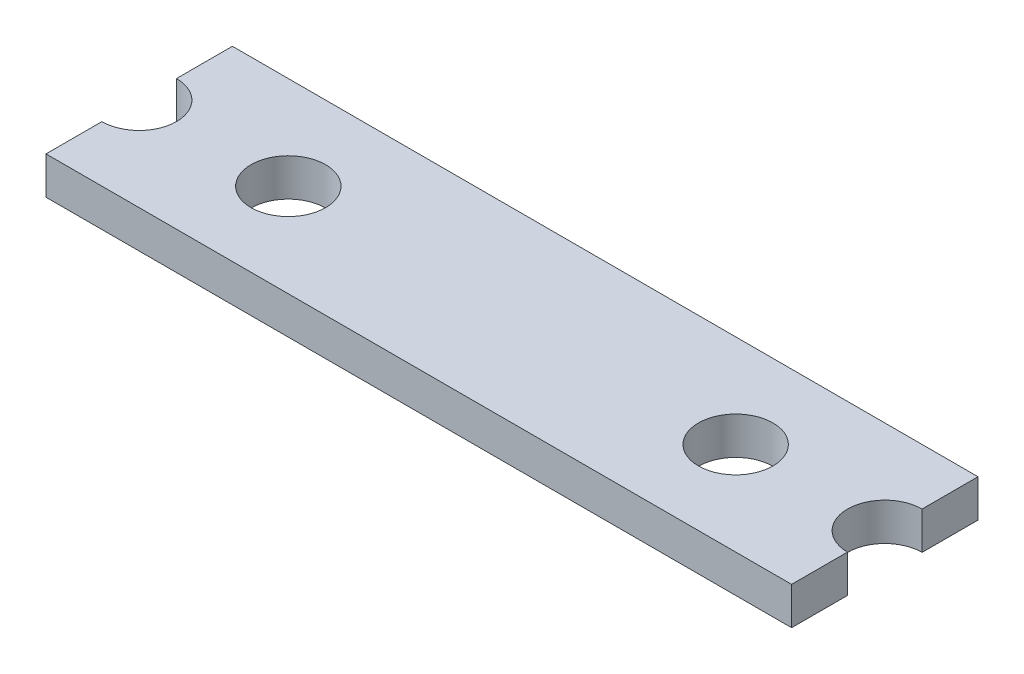
ISO-10303-21;
HEADER;
FILE_DESCRIPTION(('STEP AP214'),'2;1');
FILE_NAME('part.step','',(''),(''),'','','');
FILE_SCHEMA(('AUTOMOTIVE_DESIGN { 1 0 10303 214 1 1 1 1 }'));
ENDSEC;
DATA;
#1=APPLICATION_CONTEXT('core data for automotive mechanical design processes');
#2=APPLICATION_PROTOCOL_DEFINITION('international standard','automotive_design',2000,#1);
#3=PRODUCT_CONTEXT('',#1,'mechanical');
#4=PRODUCT('Part','Part','',(#3));
#5=PRODUCT_RELATED_PRODUCT_CATEGORY('part','',(#4));
#6=PRODUCT_DEFINITION_FORMATION('','',#4);
#7=PRODUCT_DEFINITION_CONTEXT('part definition',#1,'design');
#8=PRODUCT_DEFINITION('design','',#6,#7);
#9=PRODUCT_DEFINITION_SHAPE('','',#8);
#10=(LENGTH_UNIT() NAMED_UNIT(*) SI_UNIT(.MILLI.,.METRE.));
#11=(NAMED_UNIT(*) PLANE_ANGLE_UNIT() SI_UNIT($,.RADIAN.));
#12=(NAMED_UNIT(*) SI_UNIT($,.STERADIAN.) SOLID_ANGLE_UNIT());
#13=UNCERTAINTY_MEASURE_WITH_UNIT(LENGTH_MEASURE(1.E-05),#10,'distance_accuracy_value','');
#14=(GEOMETRIC_REPRESENTATION_CONTEXT(3) GLOBAL_UNCERTAINTY_ASSIGNED_CONTEXT((#13)) GLOBAL_UNIT_ASSIGNED_CONTEXT((#10,
#11,#12)) REPRESENTATION_CONTEXT('',''));
#15=CARTESIAN_POINT('',(0.,0.,0.));
#16=DIRECTION('',(0.,0.,1.));
#17=DIRECTION('',(1.,0.,0.));
#18=AXIS2_PLACEMENT_3D('',#15,#16,#17);
#19=CARTESIAN_POINT('',(-15.875,1.6,3.96875));
#20=DIRECTION('',(1.,0.,0.));
#21=DIRECTION('',(0.,0.,-1.));
#22=AXIS2_PLACEMENT_3D('',#19,#20,#21);
#23=PLANE('',#22);
#24=DIRECTION('',(0.,0.,1.));
#25=VECTOR('',#24,1.);
#26=CARTESIAN_POINT('',(-15.875,0.,3.96875));
#27=LINE('',#26,#25);
#28=CARTESIAN_POINT('',(-15.875,0.,-3.96875));
#29=VERTEX_POINT('',#28);
#30=CARTESIAN_POINT('',(-15.875,0.,-1.5875));
#31=VERTEX_POINT('',#30);
#32=EDGE_CURVE('E117',#29,#31,#27,.T.);
#33=ORIENTED_EDGE('',*,*,#32,.T.);
#34=DIRECTION('',(0.,1.,0.));
#35=VECTOR('',#34,1.);
#36=CARTESIAN_POINT('',(-15.875,0.,-1.5875));
#37=LINE('',#36,#35);
#38=CARTESIAN_POINT('',(-15.875,1.6,-1.5875));
#39=VERTEX_POINT('',#38);
#40=EDGE_CURVE('E55',#31,#39,#37,.T.);
#41=ORIENTED_EDGE('',*,*,#40,.T.);
#42=DIRECTION('',(0.,0.,1.));
#43=VECTOR('',#42,1.);
#44=CARTESIAN_POINT('',(-15.875,1.6,3.96875));
#45=LINE('',#44,#43);
#46=CARTESIAN_POINT('',(-15.875,1.6,-3.96875));
#47=VERTEX_POINT('',#46);
#48=EDGE_CURVE('E162',#47,#39,#45,.T.);
#49=ORIENTED_EDGE('',*,*,#48,.F.);
#50=DIRECTION('',(0.,-1.,0.));
#51=VECTOR('',#50,1.);
#52=CARTESIAN_POINT('',(-15.875,1.6,-3.96875));
#53=LINE('',#52,#51);
#54=EDGE_CURVE('E134',#47,#29,#53,.T.);
#55=ORIENTED_EDGE('',*,*,#54,.T.);
#56=EDGE_LOOP('',(#33,#41,#49,#55));
#57=FACE_BOUND('',#56,.T.);
#58=ADVANCED_FACE('F32',(#57),#23,.F.);
#59=CARTESIAN_POINT('',(15.875,1.6,3.96875));
#60=DIRECTION('',(-1.,0.,0.));
#61=DIRECTION('',(0.,0.,1.));
#62=AXIS2_PLACEMENT_3D('',#59,#60,#61);
#63=PLANE('',#62);
#64=DIRECTION('',(0.,0.,-1.));
#65=VECTOR('',#64,1.);
#66=CARTESIAN_POINT('',(15.875,0.,3.96875));
#67=LINE('',#66,#65);
#68=CARTESIAN_POINT('',(15.875,0.,3.96875));
#69=VERTEX_POINT('',#68);
#70=CARTESIAN_POINT('',(15.875,0.,1.5875));
#71=VERTEX_POINT('',#70);
#72=EDGE_CURVE('E129',#69,#71,#67,.T.);
#73=ORIENTED_EDGE('',*,*,#72,.T.);
#74=DIRECTION('',(0.,1.,0.));
#75=VECTOR('',#74,1.);
#76=CARTESIAN_POINT('',(15.875,0.,1.5875));
#77=LINE('',#76,#75);
#78=CARTESIAN_POINT('',(15.875,1.6,1.5875));
#79=VERTEX_POINT('',#78);
#80=EDGE_CURVE('E47',#71,#79,#77,.T.);
#81=ORIENTED_EDGE('',*,*,#80,.T.);
#82=DIRECTION('',(0.,0.,-1.));
#83=VECTOR('',#82,1.);
#84=CARTESIAN_POINT('',(15.875,1.6,3.96875));
#85=LINE('',#84,#83);
#86=CARTESIAN_POINT('',(15.875,1.6,3.96875));
#87=VERTEX_POINT('',#86);
#88=EDGE_CURVE('E145',#87,#79,#85,.T.);
#89=ORIENTED_EDGE('',*,*,#88,.F.);
#90=DIRECTION('',(0.,-1.,0.));
#91=VECTOR('',#90,1.);
#92=CARTESIAN_POINT('',(15.875,1.6,3.96875));
#93=LINE('',#92,#91);
#94=EDGE_CURVE('E40',#87,#69,#93,.T.);
#95=ORIENTED_EDGE('',*,*,#94,.T.);
#96=EDGE_LOOP('',(#73,#81,#89,#95));
#97=FACE_BOUND('',#96,.T.);
#98=ADVANCED_FACE('F143',(#97),#63,.F.);
#99=CARTESIAN_POINT('',(-15.875,1.6,1.5875));
#100=VERTEX_POINT('',#99);
#101=CARTESIAN_POINT('',(-15.875,1.6,3.96875));
#102=VERTEX_POINT('',#101);
#103=EDGE_CURVE('E110',#100,#102,#45,.T.);
#104=ORIENTED_EDGE('',*,*,#103,.F.);
#105=DIRECTION('',(0.,1.,0.));
#106=VECTOR('',#105,1.);
#107=CARTESIAN_POINT('',(-15.875,0.,1.5875));
#108=LINE('',#107,#106);
#109=CARTESIAN_POINT('',(-15.875,0.,1.5875));
#110=VERTEX_POINT('',#109);
#111=EDGE_CURVE('E97',#110,#100,#108,.T.);
#112=ORIENTED_EDGE('',*,*,#111,.F.);
#113=CARTESIAN_POINT('',(-15.875,0.,3.96875));
#114=VERTEX_POINT('',#113);
#115=EDGE_CURVE('E108',#110,#114,#27,.T.);
#116=ORIENTED_EDGE('',*,*,#115,.T.);
#117=DIRECTION('',(0.,-1.,0.));
#118=VECTOR('',#117,1.);
#119=CARTESIAN_POINT('',(-15.875,1.6,3.96875));
#120=LINE('',#119,#118);
#121=EDGE_CURVE('E11',#102,#114,#120,.T.);
#122=ORIENTED_EDGE('',*,*,#121,.F.);
#123=EDGE_LOOP('',(#104,#112,#116,#122));
#124=FACE_BOUND('',#123,.T.);
#125=ADVANCED_FACE('F34',(#124),#23,.F.);
#126=CARTESIAN_POINT('',(15.875,1.6,3.96875));
#127=DIRECTION('',(0.,0.,-1.));
#128=DIRECTION('',(-1.,0.,0.));
#129=AXIS2_PLACEMENT_3D('',#126,#127,#128);
#130=PLANE('',#129);
#131=DIRECTION('',(1.,0.,0.));
#132=VECTOR('',#131,1.);
#133=CARTESIAN_POINT('',(15.875,0.,3.96875));
#134=LINE('',#133,#132);
#135=EDGE_CURVE('E116',#114,#69,#134,.T.);
#136=ORIENTED_EDGE('',*,*,#135,.T.);
#137=ORIENTED_EDGE('',*,*,#94,.F.);
#138=DIRECTION('',(1.,0.,0.));
#139=VECTOR('',#138,1.);
#140=CARTESIAN_POINT('',(15.875,1.6,3.96875));
#141=LINE('',#140,#139);
#142=EDGE_CURVE('E165',#102,#87,#141,.T.);
#143=ORIENTED_EDGE('',*,*,#142,.F.);
#144=ORIENTED_EDGE('',*,*,#121,.T.);
#145=EDGE_LOOP('',(#136,#137,#143,#144));
#146=FACE_BOUND('',#145,.T.);
#147=ADVANCED_FACE('F216',(#146),#130,.F.);
#148=CARTESIAN_POINT('',(15.875,1.6,-1.5875));
#149=VERTEX_POINT('',#148);
#150=CARTESIAN_POINT('',(15.875,1.6,-3.96875));
#151=VERTEX_POINT('',#150);
#152=EDGE_CURVE('E166',#149,#151,#85,.T.);
#153=ORIENTED_EDGE('',*,*,#152,.F.);
#154=DIRECTION('',(0.,1.,0.));
#155=VECTOR('',#154,1.);
#156=CARTESIAN_POINT('',(15.875,0.,-1.5875));
#157=LINE('',#156,#155);
#158=CARTESIAN_POINT('',(15.875,0.,-1.5875));
#159=VERTEX_POINT('',#158);
#160=EDGE_CURVE('E153',#159,#149,#157,.T.);
#161=ORIENTED_EDGE('',*,*,#160,.F.);
#162=CARTESIAN_POINT('',(15.875,0.,-3.96875));
#163=VERTEX_POINT('',#162);
#164=EDGE_CURVE('E128',#159,#163,#67,.T.);
#165=ORIENTED_EDGE('',*,*,#164,.T.);
#166=DIRECTION('',(0.,-1.,0.));
#167=VECTOR('',#166,1.);
#168=CARTESIAN_POINT('',(15.875,1.6,-3.96875));
#169=LINE('',#168,#167);
#170=EDGE_CURVE('E137',#151,#163,#169,.T.);
#171=ORIENTED_EDGE('',*,*,#170,.F.);
#172=EDGE_LOOP('',(#153,#161,#165,#171));
#173=FACE_BOUND('',#172,.T.);
#174=ADVANCED_FACE('F176',(#173),#63,.F.);
#175=CARTESIAN_POINT('',(15.875,1.6,-3.96875));
#176=DIRECTION('',(0.,0.,1.));
#177=DIRECTION('',(1.,0.,0.));
#178=AXIS2_PLACEMENT_3D('',#175,#176,#177);
#179=PLANE('',#178);
#180=DIRECTION('',(-1.,0.,0.));
#181=VECTOR('',#180,1.);
#182=CARTESIAN_POINT('',(15.875,0.,-3.96875));
#183=LINE('',#182,#181);
#184=EDGE_CURVE('E132',#163,#29,#183,.T.);
#185=ORIENTED_EDGE('',*,*,#184,.T.);
#186=ORIENTED_EDGE('',*,*,#54,.F.);
#187=DIRECTION('',(-1.,0.,0.));
#188=VECTOR('',#187,1.);
#189=CARTESIAN_POINT('',(15.875,1.6,-3.96875));
#190=LINE('',#189,#188);
#191=EDGE_CURVE('E125',#151,#47,#190,.T.);
#192=ORIENTED_EDGE('',*,*,#191,.F.);
#193=ORIENTED_EDGE('',*,*,#170,.T.);
#194=EDGE_LOOP('',(#185,#186,#192,#193));
#195=FACE_BOUND('',#194,.T.);
#196=ADVANCED_FACE('F178',(#195),#179,.F.);
#197=CARTESIAN_POINT('',(0.,1.6,0.));
#198=DIRECTION('',(0.,1.,0.));
#199=DIRECTION('',(0.,0.,1.));
#200=AXIS2_PLACEMENT_3D('',#197,#198,#199);
#201=PLANE('',#200);
#202=CARTESIAN_POINT('',(15.875,1.6,0.));
#203=DIRECTION('',(0.,1.,0.));
#204=DIRECTION('',(0.,0.,1.));
#205=AXIS2_PLACEMENT_3D('',#202,#203,#204);
#206=CIRCLE('',#205,1.5875);
#207=EDGE_CURVE('E151',#149,#79,#206,.T.);
#208=ORIENTED_EDGE('',*,*,#207,.F.);
#209=ORIENTED_EDGE('',*,*,#152,.T.);
#210=ORIENTED_EDGE('',*,*,#191,.T.);
#211=ORIENTED_EDGE('',*,*,#48,.T.);
#212=CARTESIAN_POINT('',(-15.875,1.6,0.));
#213=DIRECTION('',(0.,1.,0.));
#214=DIRECTION('',(0.,0.,1.));
#215=AXIS2_PLACEMENT_3D('',#212,#213,#214);
#216=CIRCLE('',#215,1.5875);
#217=EDGE_CURVE('E103',#100,#39,#216,.T.);
#218=ORIENTED_EDGE('',*,*,#217,.F.);
#219=ORIENTED_EDGE('',*,*,#103,.T.);
#220=ORIENTED_EDGE('',*,*,#142,.T.);
#221=ORIENTED_EDGE('',*,*,#88,.T.);
#222=EDGE_LOOP('',(#208,#209,#210,#211,#218,#219,#220,#221));
#223=FACE_BOUND('',#222,.T.);
#224=CARTESIAN_POINT('',(9.525,1.6,0.));
#225=DIRECTION('',(0.,1.,0.));
#226=DIRECTION('',(0.,0.,1.));
#227=AXIS2_PLACEMENT_3D('',#224,#225,#226);
#228=CIRCLE('',#227,1.5875);
#229=CARTESIAN_POINT('',(9.525,1.6,1.5875));
#230=VERTEX_POINT('',#229);
#231=EDGE_CURVE('E111',#230,#230,#228,.T.);
#232=ORIENTED_EDGE('',*,*,#231,.F.);
#233=EDGE_LOOP('',(#232));
#234=FACE_BOUND('',#233,.T.);
#235=CARTESIAN_POINT('',(-9.525,1.6,0.));
#236=DIRECTION('',(0.,1.,0.));
#237=DIRECTION('',(0.,0.,1.));
#238=AXIS2_PLACEMENT_3D('',#235,#236,#237);
#239=CIRCLE('',#238,1.5875);
#240=CARTESIAN_POINT('',(-9.525,1.6,1.5875));
#241=VERTEX_POINT('',#240);
#242=EDGE_CURVE('E121',#241,#241,#239,.T.);
#243=ORIENTED_EDGE('',*,*,#242,.F.);
#244=EDGE_LOOP('',(#243));
#245=FACE_BOUND('',#244,.T.);
#246=ADVANCED_FACE('F171',(#223,#234,#245),#201,.T.);
#247=CARTESIAN_POINT('',(0.,0.,0.));
#248=DIRECTION('',(0.,1.,0.));
#249=DIRECTION('',(0.,0.,1.));
#250=AXIS2_PLACEMENT_3D('',#247,#248,#249);
#251=PLANE('',#250);
#252=CARTESIAN_POINT('',(9.525,0.,0.));
#253=DIRECTION('',(0.,1.,0.));
#254=DIRECTION('',(0.,0.,1.));
#255=AXIS2_PLACEMENT_3D('',#252,#253,#254);
#256=CIRCLE('',#255,1.5875);
#257=CARTESIAN_POINT('',(9.525,0.,1.5875));
#258=VERTEX_POINT('',#257);
#259=EDGE_CURVE('E161',#258,#258,#256,.T.);
#260=ORIENTED_EDGE('',*,*,#259,.T.);
#261=EDGE_LOOP('',(#260));
#262=FACE_BOUND('',#261,.T.);
#263=CARTESIAN_POINT('',(-9.525,0.,0.));
#264=DIRECTION('',(0.,1.,0.));
#265=DIRECTION('',(0.,0.,1.));
#266=AXIS2_PLACEMENT_3D('',#263,#264,#265);
#267=CIRCLE('',#266,1.5875);
#268=CARTESIAN_POINT('',(-9.525,0.,1.5875));
#269=VERTEX_POINT('',#268);
#270=EDGE_CURVE('E118',#269,#269,#267,.T.);
#271=ORIENTED_EDGE('',*,*,#270,.T.);
#272=EDGE_LOOP('',(#271));
#273=FACE_BOUND('',#272,.T.);
#274=ORIENTED_EDGE('',*,*,#164,.F.);
#275=CARTESIAN_POINT('',(15.875,0.,0.));
#276=DIRECTION('',(0.,1.,0.));
#277=DIRECTION('',(0.,0.,1.));
#278=AXIS2_PLACEMENT_3D('',#275,#276,#277);
#279=CIRCLE('',#278,1.5875);
#280=EDGE_CURVE('E148',#159,#71,#279,.T.);
#281=ORIENTED_EDGE('',*,*,#280,.T.);
#282=ORIENTED_EDGE('',*,*,#72,.F.);
#283=ORIENTED_EDGE('',*,*,#135,.F.);
#284=ORIENTED_EDGE('',*,*,#115,.F.);
#285=CARTESIAN_POINT('',(-15.875,0.,0.));
#286=DIRECTION('',(0.,1.,0.));
#287=DIRECTION('',(0.,0.,1.));
#288=AXIS2_PLACEMENT_3D('',#285,#286,#287);
#289=CIRCLE('',#288,1.5875);
#290=EDGE_CURVE('E94',#110,#31,#289,.T.);
#291=ORIENTED_EDGE('',*,*,#290,.T.);
#292=ORIENTED_EDGE('',*,*,#32,.F.);
#293=ORIENTED_EDGE('',*,*,#184,.F.);
#294=EDGE_LOOP('',(#274,#281,#282,#283,#284,#291,#292,#293));
#295=FACE_BOUND('',#294,.T.);
#296=ADVANCED_FACE('F114',(#262,#273,#295),#251,.F.);
#297=CARTESIAN_POINT('',(-9.525,0.,0.));
#298=DIRECTION('',(0.,1.,0.));
#299=DIRECTION('',(0.,0.,1.));
#300=AXIS2_PLACEMENT_3D('',#297,#298,#299);
#301=CYLINDRICAL_SURFACE('',#300,1.5875);
#302=ORIENTED_EDGE('',*,*,#270,.F.);
#303=EDGE_LOOP('',(#302));
#304=FACE_BOUND('',#303,.T.);
#305=ORIENTED_EDGE('',*,*,#242,.T.);
#306=EDGE_LOOP('',(#305));
#307=FACE_BOUND('',#306,.T.);
#308=ADVANCED_FACE('F193',(#304,#307),#301,.F.);
#309=CARTESIAN_POINT('',(9.525,0.,0.));
#310=DIRECTION('',(0.,1.,0.));
#311=DIRECTION('',(0.,0.,1.));
#312=AXIS2_PLACEMENT_3D('',#309,#310,#311);
#313=CYLINDRICAL_SURFACE('',#312,1.5875);
#314=ORIENTED_EDGE('',*,*,#259,.F.);
#315=EDGE_LOOP('',(#314));
#316=FACE_BOUND('',#315,.T.);
#317=ORIENTED_EDGE('',*,*,#231,.T.);
#318=EDGE_LOOP('',(#317));
#319=FACE_BOUND('',#318,.T.);
#320=ADVANCED_FACE('F190',(#316,#319),#313,.F.);
#321=CARTESIAN_POINT('',(-15.875,0.,0.));
#322=DIRECTION('',(0.,1.,0.));
#323=DIRECTION('',(0.,0.,1.));
#324=AXIS2_PLACEMENT_3D('',#321,#322,#323);
#325=CYLINDRICAL_SURFACE('',#324,1.5875);
#326=ORIENTED_EDGE('',*,*,#217,.T.);
#327=ORIENTED_EDGE('',*,*,#40,.F.);
#328=ORIENTED_EDGE('',*,*,#290,.F.);
#329=ORIENTED_EDGE('',*,*,#111,.T.);
#330=EDGE_LOOP('',(#326,#327,#328,#329));
#331=FACE_BOUND('',#330,.T.);
#332=ADVANCED_FACE('F96',(#331),#325,.F.);
#333=CARTESIAN_POINT('',(15.875,0.,0.));
#334=DIRECTION('',(0.,1.,0.));
#335=DIRECTION('',(0.,0.,1.));
#336=AXIS2_PLACEMENT_3D('',#333,#334,#335);
#337=CYLINDRICAL_SURFACE('',#336,1.5875);
#338=ORIENTED_EDGE('',*,*,#207,.T.);
#339=ORIENTED_EDGE('',*,*,#80,.F.);
#340=ORIENTED_EDGE('',*,*,#280,.F.);
#341=ORIENTED_EDGE('',*,*,#160,.T.);
#342=EDGE_LOOP('',(#338,#339,#340,#341));
#343=FACE_BOUND('',#342,.T.);
#344=ADVANCED_FACE('F258',(#343),#337,.F.);
#345=CLOSED_SHELL('',(#58,#98,#125,#147,#174,#196,#246,#296,#308,#320,#332,#344));
#346=MANIFOLD_SOLID_BREP('B2',#345);
#347=ADVANCED_BREP_SHAPE_REPRESENTATION('',(#18,#346),#14);
#348=SHAPE_DEFINITION_REPRESENTATION(#9,#347);
ENDSEC;
END-ISO-10303-21;
